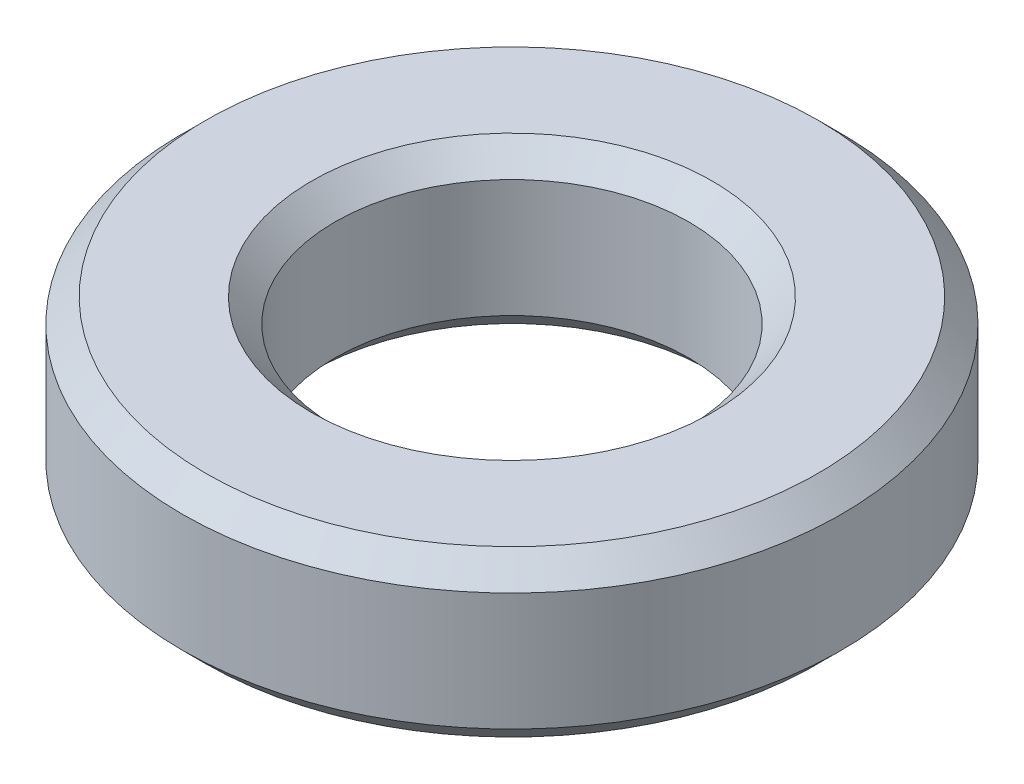
ISO-10303-21;
HEADER;
FILE_DESCRIPTION(('STEP AP214'),'2;1');
FILE_NAME('part.step','',(''),(''),'','','');
FILE_SCHEMA(('AUTOMOTIVE_DESIGN { 1 0 10303 214 1 1 1 1 }'));
ENDSEC;
DATA;
#1=APPLICATION_CONTEXT('core data for automotive mechanical design processes');
#2=APPLICATION_PROTOCOL_DEFINITION('international standard','automotive_design',2000,#1);
#3=PRODUCT_CONTEXT('',#1,'mechanical');
#4=PRODUCT('Part','Part','',(#3));
#5=PRODUCT_RELATED_PRODUCT_CATEGORY('part','',(#4));
#6=PRODUCT_DEFINITION_FORMATION('','',#4);
#7=PRODUCT_DEFINITION_CONTEXT('part definition',#1,'design');
#8=PRODUCT_DEFINITION('design','',#6,#7);
#9=PRODUCT_DEFINITION_SHAPE('','',#8);
#10=(LENGTH_UNIT() NAMED_UNIT(*) SI_UNIT(.MILLI.,.METRE.));
#11=(NAMED_UNIT(*) PLANE_ANGLE_UNIT() SI_UNIT($,.RADIAN.));
#12=(NAMED_UNIT(*) SI_UNIT($,.STERADIAN.) SOLID_ANGLE_UNIT());
#13=UNCERTAINTY_MEASURE_WITH_UNIT(LENGTH_MEASURE(1.E-05),#10,'distance_accuracy_value','');
#14=(GEOMETRIC_REPRESENTATION_CONTEXT(3) GLOBAL_UNCERTAINTY_ASSIGNED_CONTEXT((#13)) GLOBAL_UNIT_ASSIGNED_CONTEXT((#10,
#11,#12)) REPRESENTATION_CONTEXT('',''));
#15=CARTESIAN_POINT('',(0.,0.,0.));
#16=DIRECTION('',(0.,0.,1.));
#17=DIRECTION('',(1.,0.,0.));
#18=AXIS2_PLACEMENT_3D('',#15,#16,#17);
#19=CARTESIAN_POINT('',(0.,7.,0.));
#20=DIRECTION('',(0.,1.,0.));
#21=DIRECTION('',(0.,0.,1.));
#22=AXIS2_PLACEMENT_3D('',#19,#20,#21);
#23=PLANE('',#22);
#24=CARTESIAN_POINT('',(0.,7.,0.));
#25=DIRECTION('',(0.,1.,0.));
#26=DIRECTION('',(0.,0.,1.));
#27=AXIS2_PLACEMENT_3D('',#24,#25,#26);
#28=CIRCLE('',#27,12.99);
#29=CARTESIAN_POINT('',(0.,7.,12.99));
#30=VERTEX_POINT('',#29);
#31=EDGE_CURVE('E57',#30,#30,#28,.T.);
#32=ORIENTED_EDGE('',*,*,#31,.T.);
#33=EDGE_LOOP('',(#32));
#34=FACE_BOUND('',#33,.T.);
#35=CARTESIAN_POINT('',(0.,7.,0.));
#36=DIRECTION('',(0.,1.,0.));
#37=DIRECTION('',(0.,0.,1.));
#38=AXIS2_PLACEMENT_3D('',#35,#36,#37);
#39=CIRCLE('',#38,8.51);
#40=CARTESIAN_POINT('',(0.,7.,8.51));
#41=VERTEX_POINT('',#40);
#42=EDGE_CURVE('E62',#41,#41,#39,.F.);
#43=ORIENTED_EDGE('',*,*,#42,.T.);
#44=EDGE_LOOP('',(#43));
#45=FACE_BOUND('',#44,.T.);
#46=ADVANCED_FACE('F43',(#34,#45),#23,.T.);
#47=CARTESIAN_POINT('',(0.,0.,0.));
#48=DIRECTION('',(0.,1.,0.));
#49=DIRECTION('',(0.,0.,1.));
#50=AXIS2_PLACEMENT_3D('',#47,#48,#49);
#51=PLANE('',#50);
#52=CARTESIAN_POINT('',(0.,0.,0.));
#53=DIRECTION('',(0.,1.,0.));
#54=DIRECTION('',(0.,0.,1.));
#55=AXIS2_PLACEMENT_3D('',#52,#53,#54);
#56=CIRCLE('',#55,12.99);
#57=CARTESIAN_POINT('',(0.,0.,12.99));
#58=VERTEX_POINT('',#57);
#59=EDGE_CURVE('E68',#58,#58,#56,.F.);
#60=ORIENTED_EDGE('',*,*,#59,.T.);
#61=EDGE_LOOP('',(#60));
#62=FACE_BOUND('',#61,.T.);
#63=CARTESIAN_POINT('',(0.,0.,0.));
#64=DIRECTION('',(0.,1.,0.));
#65=DIRECTION('',(0.,0.,1.));
#66=AXIS2_PLACEMENT_3D('',#63,#64,#65);
#67=CIRCLE('',#66,8.51000000000001);
#68=CARTESIAN_POINT('',(0.,0.,8.51000000000001));
#69=VERTEX_POINT('',#68);
#70=EDGE_CURVE('E72',#69,#69,#67,.T.);
#71=ORIENTED_EDGE('',*,*,#70,.T.);
#72=EDGE_LOOP('',(#71));
#73=FACE_BOUND('',#72,.T.);
#74=ADVANCED_FACE('F97',(#62,#73),#51,.F.);
#75=CARTESIAN_POINT('',(0.,7.,0.));
#76=DIRECTION('',(0.,-1.,0.));
#77=DIRECTION('',(0.,0.,-1.));
#78=AXIS2_PLACEMENT_3D('',#75,#76,#77);
#79=CYLINDRICAL_SURFACE('',#78,13.99);
#80=CARTESIAN_POINT('',(0.,1.00000000000001,0.));
#81=DIRECTION('',(0.,1.,0.));
#82=DIRECTION('',(0.,0.,1.));
#83=AXIS2_PLACEMENT_3D('',#80,#81,#82);
#84=CIRCLE('',#83,13.99);
#85=CARTESIAN_POINT('',(0.,1.00000000000001,13.99));
#86=VERTEX_POINT('',#85);
#87=EDGE_CURVE('E76',#86,#86,#84,.T.);
#88=ORIENTED_EDGE('',*,*,#87,.T.);
#89=EDGE_LOOP('',(#88));
#90=FACE_BOUND('',#89,.T.);
#91=CARTESIAN_POINT('',(0.,5.99999999999999,0.));
#92=DIRECTION('',(0.,1.,0.));
#93=DIRECTION('',(0.,0.,1.));
#94=AXIS2_PLACEMENT_3D('',#91,#92,#93);
#95=CIRCLE('',#94,13.99);
#96=CARTESIAN_POINT('',(0.,5.99999999999999,13.99));
#97=VERTEX_POINT('',#96);
#98=EDGE_CURVE('E80',#97,#97,#95,.F.);
#99=ORIENTED_EDGE('',*,*,#98,.T.);
#100=EDGE_LOOP('',(#99));
#101=FACE_BOUND('',#100,.T.);
#102=ADVANCED_FACE('F85',(#90,#101),#79,.T.);
#103=CARTESIAN_POINT('',(0.,7.,0.));
#104=DIRECTION('',(0.,-1.,0.));
#105=DIRECTION('',(0.,0.,-1.));
#106=AXIS2_PLACEMENT_3D('',#103,#104,#105);
#107=CYLINDRICAL_SURFACE('',#106,7.51);
#108=CARTESIAN_POINT('',(0.,1.00000000000001,0.));
#109=DIRECTION('',(0.,1.,0.));
#110=DIRECTION('',(0.,0.,1.));
#111=AXIS2_PLACEMENT_3D('',#108,#109,#110);
#112=CIRCLE('',#111,7.51);
#113=CARTESIAN_POINT('',(0.,1.00000000000001,7.51));
#114=VERTEX_POINT('',#113);
#115=EDGE_CURVE('E10',#114,#114,#112,.F.);
#116=ORIENTED_EDGE('',*,*,#115,.T.);
#117=EDGE_LOOP('',(#116));
#118=FACE_BOUND('',#117,.T.);
#119=CARTESIAN_POINT('',(0.,6.,0.));
#120=DIRECTION('',(0.,1.,0.));
#121=DIRECTION('',(0.,0.,1.));
#122=AXIS2_PLACEMENT_3D('',#119,#120,#121);
#123=CIRCLE('',#122,7.51);
#124=CARTESIAN_POINT('',(0.,6.,7.51));
#125=VERTEX_POINT('',#124);
#126=EDGE_CURVE('E52',#125,#125,#123,.T.);
#127=ORIENTED_EDGE('',*,*,#126,.T.);
#128=EDGE_LOOP('',(#127));
#129=FACE_BOUND('',#128,.T.);
#130=ADVANCED_FACE('F122',(#118,#129),#107,.F.);
#131=CARTESIAN_POINT('',(0.,1.00000000000001,0.));
#132=DIRECTION('',(0.,1.,0.));
#133=DIRECTION('',(0.,0.,1.));
#134=AXIS2_PLACEMENT_3D('',#131,#132,#133);
#135=CONICAL_SURFACE('',#134,13.99,0.785398163397451);
#136=ORIENTED_EDGE('',*,*,#59,.F.);
#137=EDGE_LOOP('',(#136));
#138=FACE_BOUND('',#137,.T.);
#139=ORIENTED_EDGE('',*,*,#87,.F.);
#140=EDGE_LOOP('',(#139));
#141=FACE_BOUND('',#140,.T.);
#142=ADVANCED_FACE('F91',(#138,#141),#135,.T.);
#143=CARTESIAN_POINT('',(0.,7.,0.));
#144=DIRECTION('',(0.,-1.,0.));
#145=DIRECTION('',(0.,0.,-1.));
#146=AXIS2_PLACEMENT_3D('',#143,#144,#145);
#147=CONICAL_SURFACE('',#146,12.99,0.785398163397447);
#148=ORIENTED_EDGE('',*,*,#98,.F.);
#149=EDGE_LOOP('',(#148));
#150=FACE_BOUND('',#149,.T.);
#151=ORIENTED_EDGE('',*,*,#31,.F.);
#152=EDGE_LOOP('',(#151));
#153=FACE_BOUND('',#152,.T.);
#154=ADVANCED_FACE('F87',(#150,#153),#147,.T.);
#155=CARTESIAN_POINT('',(0.,0.,0.));
#156=DIRECTION('',(0.,-1.,0.));
#157=DIRECTION('',(0.,0.,-1.));
#158=AXIS2_PLACEMENT_3D('',#155,#156,#157);
#159=CONICAL_SURFACE('',#158,8.51000000000001,0.785398163397448);
#160=ORIENTED_EDGE('',*,*,#115,.F.);
#161=EDGE_LOOP('',(#160));
#162=FACE_BOUND('',#161,.T.);
#163=ORIENTED_EDGE('',*,*,#70,.F.);
#164=EDGE_LOOP('',(#163));
#165=FACE_BOUND('',#164,.T.);
#166=ADVANCED_FACE('F90',(#162,#165),#159,.F.);
#167=CARTESIAN_POINT('',(0.,6.,0.));
#168=DIRECTION('',(0.,1.,0.));
#169=DIRECTION('',(0.,0.,1.));
#170=AXIS2_PLACEMENT_3D('',#167,#168,#169);
#171=CONICAL_SURFACE('',#170,7.51,0.785398163397449);
#172=ORIENTED_EDGE('',*,*,#42,.F.);
#173=EDGE_LOOP('',(#172));
#174=FACE_BOUND('',#173,.T.);
#175=ORIENTED_EDGE('',*,*,#126,.F.);
#176=EDGE_LOOP('',(#175));
#177=FACE_BOUND('',#176,.T.);
#178=ADVANCED_FACE('F46',(#174,#177),#171,.F.);
#179=CLOSED_SHELL('',(#46,#74,#102,#130,#142,#154,#166,#178));
#180=MANIFOLD_SOLID_BREP('B2',#179);
#181=ADVANCED_BREP_SHAPE_REPRESENTATION('',(#18,#180),#14);
#182=SHAPE_DEFINITION_REPRESENTATION(#9,#181);
ENDSEC;
END-ISO-10303-21;
